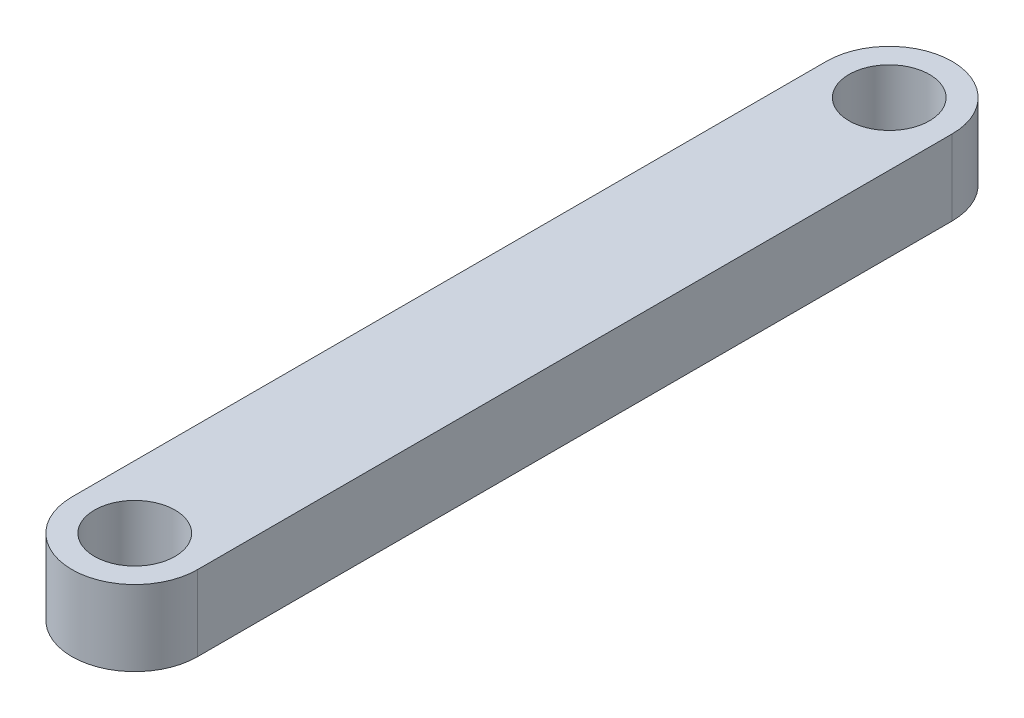
ISO-10303-21;
HEADER;
FILE_DESCRIPTION(('STEP AP214'),'2;1');
FILE_NAME('part.step','',(''),(''),'','','');
FILE_SCHEMA(('AUTOMOTIVE_DESIGN { 1 0 10303 214 1 1 1 1 }'));
ENDSEC;
DATA;
#1=APPLICATION_CONTEXT('core data for automotive mechanical design processes');
#2=APPLICATION_PROTOCOL_DEFINITION('international standard','automotive_design',2000,#1);
#3=PRODUCT_CONTEXT('',#1,'mechanical');
#4=PRODUCT('Part','Part','',(#3));
#5=PRODUCT_RELATED_PRODUCT_CATEGORY('part','',(#4));
#6=PRODUCT_DEFINITION_FORMATION('','',#4);
#7=PRODUCT_DEFINITION_CONTEXT('part definition',#1,'design');
#8=PRODUCT_DEFINITION('design','',#6,#7);
#9=PRODUCT_DEFINITION_SHAPE('','',#8);
#10=(LENGTH_UNIT() NAMED_UNIT(*) SI_UNIT(.MILLI.,.METRE.));
#11=(NAMED_UNIT(*) PLANE_ANGLE_UNIT() SI_UNIT($,.RADIAN.));
#12=(NAMED_UNIT(*) SI_UNIT($,.STERADIAN.) SOLID_ANGLE_UNIT());
#13=UNCERTAINTY_MEASURE_WITH_UNIT(LENGTH_MEASURE(1.E-05),#10,'distance_accuracy_value','');
#14=(GEOMETRIC_REPRESENTATION_CONTEXT(3) GLOBAL_UNCERTAINTY_ASSIGNED_CONTEXT((#13)) GLOBAL_UNIT_ASSIGNED_CONTEXT((#10,
#11,#12)) REPRESENTATION_CONTEXT('',''));
#15=CARTESIAN_POINT('',(0.,0.,0.));
#16=DIRECTION('',(0.,0.,1.));
#17=DIRECTION('',(1.,0.,0.));
#18=AXIS2_PLACEMENT_3D('',#15,#16,#17);
#19=CARTESIAN_POINT('',(0.,3.,0.));
#20=DIRECTION('',(0.,-1.,0.));
#21=DIRECTION('',(0.,0.,-1.));
#22=AXIS2_PLACEMENT_3D('',#19,#20,#21);
#23=CYLINDRICAL_SURFACE('',#22,2.5);
#24=CARTESIAN_POINT('',(0.,0.,0.));
#25=DIRECTION('',(0.,1.,0.));
#26=DIRECTION('',(0.,0.,1.));
#27=AXIS2_PLACEMENT_3D('',#24,#25,#26);
#28=CIRCLE('',#27,2.5);
#29=CARTESIAN_POINT('',(2.5,0.,0.));
#30=VERTEX_POINT('',#29);
#31=CARTESIAN_POINT('',(-2.5,0.,0.));
#32=VERTEX_POINT('',#31);
#33=EDGE_CURVE('E113',#30,#32,#28,.T.);
#34=ORIENTED_EDGE('',*,*,#33,.T.);
#35=DIRECTION('',(0.,-1.,0.));
#36=VECTOR('',#35,1.);
#37=CARTESIAN_POINT('',(-2.5,3.,0.));
#38=LINE('',#37,#36);
#39=CARTESIAN_POINT('',(-2.5,3.,0.));
#40=VERTEX_POINT('',#39);
#41=EDGE_CURVE('E11',#40,#32,#38,.T.);
#42=ORIENTED_EDGE('',*,*,#41,.F.);
#43=CARTESIAN_POINT('',(0.,3.,0.));
#44=DIRECTION('',(0.,1.,0.));
#45=DIRECTION('',(0.,0.,1.));
#46=AXIS2_PLACEMENT_3D('',#43,#44,#45);
#47=CIRCLE('',#46,2.5);
#48=CARTESIAN_POINT('',(2.5,3.,0.));
#49=VERTEX_POINT('',#48);
#50=EDGE_CURVE('E97',#49,#40,#47,.T.);
#51=ORIENTED_EDGE('',*,*,#50,.F.);
#52=DIRECTION('',(0.,-1.,0.));
#53=VECTOR('',#52,1.);
#54=CARTESIAN_POINT('',(2.5,3.,0.));
#55=LINE('',#54,#53);
#56=EDGE_CURVE('E109',#49,#30,#55,.T.);
#57=ORIENTED_EDGE('',*,*,#56,.T.);
#58=EDGE_LOOP('',(#34,#42,#51,#57));
#59=FACE_BOUND('',#58,.T.);
#60=ADVANCED_FACE('F45',(#59),#23,.T.);
#61=CARTESIAN_POINT('',(-2.5,3.,0.));
#62=DIRECTION('',(1.,0.,0.));
#63=DIRECTION('',(0.,0.,-1.));
#64=AXIS2_PLACEMENT_3D('',#61,#62,#63);
#65=PLANE('',#64);
#66=DIRECTION('',(0.,0.,1.));
#67=VECTOR('',#66,1.);
#68=CARTESIAN_POINT('',(-2.5,0.,0.));
#69=LINE('',#68,#67);
#70=CARTESIAN_POINT('',(-2.5,0.,30.));
#71=VERTEX_POINT('',#70);
#72=EDGE_CURVE('E102',#32,#71,#69,.T.);
#73=ORIENTED_EDGE('',*,*,#72,.T.);
#74=DIRECTION('',(0.,-1.,0.));
#75=VECTOR('',#74,1.);
#76=CARTESIAN_POINT('',(-2.5,3.,30.));
#77=LINE('',#76,#75);
#78=CARTESIAN_POINT('',(-2.5,3.,30.));
#79=VERTEX_POINT('',#78);
#80=EDGE_CURVE('E54',#79,#71,#77,.T.);
#81=ORIENTED_EDGE('',*,*,#80,.F.);
#82=DIRECTION('',(0.,0.,1.));
#83=VECTOR('',#82,1.);
#84=CARTESIAN_POINT('',(-2.5,3.,0.));
#85=LINE('',#84,#83);
#86=EDGE_CURVE('E92',#40,#79,#85,.T.);
#87=ORIENTED_EDGE('',*,*,#86,.F.);
#88=ORIENTED_EDGE('',*,*,#41,.T.);
#89=EDGE_LOOP('',(#73,#81,#87,#88));
#90=FACE_BOUND('',#89,.T.);
#91=ADVANCED_FACE('F101',(#90),#65,.F.);
#92=CARTESIAN_POINT('',(0.,3.,30.));
#93=DIRECTION('',(0.,-1.,0.));
#94=DIRECTION('',(0.,0.,-1.));
#95=AXIS2_PLACEMENT_3D('',#92,#93,#94);
#96=CYLINDRICAL_SURFACE('',#95,2.5);
#97=CARTESIAN_POINT('',(0.,0.,30.));
#98=DIRECTION('',(0.,1.,0.));
#99=DIRECTION('',(0.,0.,1.));
#100=AXIS2_PLACEMENT_3D('',#97,#98,#99);
#101=CIRCLE('',#100,2.5);
#102=CARTESIAN_POINT('',(2.5,0.,30.));
#103=VERTEX_POINT('',#102);
#104=EDGE_CURVE('E79',#71,#103,#101,.T.);
#105=ORIENTED_EDGE('',*,*,#104,.T.);
#106=DIRECTION('',(0.,-1.,0.));
#107=VECTOR('',#106,1.);
#108=CARTESIAN_POINT('',(2.5,3.,30.));
#109=LINE('',#108,#107);
#110=CARTESIAN_POINT('',(2.5,3.,30.));
#111=VERTEX_POINT('',#110);
#112=EDGE_CURVE('E104',#111,#103,#109,.T.);
#113=ORIENTED_EDGE('',*,*,#112,.F.);
#114=CARTESIAN_POINT('',(0.,3.,30.));
#115=DIRECTION('',(0.,1.,0.));
#116=DIRECTION('',(0.,0.,1.));
#117=AXIS2_PLACEMENT_3D('',#114,#115,#116);
#118=CIRCLE('',#117,2.5);
#119=EDGE_CURVE('E95',#79,#111,#118,.T.);
#120=ORIENTED_EDGE('',*,*,#119,.F.);
#121=ORIENTED_EDGE('',*,*,#80,.T.);
#122=EDGE_LOOP('',(#105,#113,#120,#121));
#123=FACE_BOUND('',#122,.T.);
#124=ADVANCED_FACE('F105',(#123),#96,.T.);
#125=CARTESIAN_POINT('',(2.5,3.,0.));
#126=DIRECTION('',(-1.,0.,0.));
#127=DIRECTION('',(0.,0.,1.));
#128=AXIS2_PLACEMENT_3D('',#125,#126,#127);
#129=PLANE('',#128);
#130=DIRECTION('',(0.,0.,-1.));
#131=VECTOR('',#130,1.);
#132=CARTESIAN_POINT('',(2.5,0.,0.));
#133=LINE('',#132,#131);
#134=EDGE_CURVE('E85',#103,#30,#133,.T.);
#135=ORIENTED_EDGE('',*,*,#134,.T.);
#136=ORIENTED_EDGE('',*,*,#56,.F.);
#137=DIRECTION('',(0.,0.,-1.));
#138=VECTOR('',#137,1.);
#139=CARTESIAN_POINT('',(2.5,3.,0.));
#140=LINE('',#139,#138);
#141=EDGE_CURVE('E62',#111,#49,#140,.T.);
#142=ORIENTED_EDGE('',*,*,#141,.F.);
#143=ORIENTED_EDGE('',*,*,#112,.T.);
#144=EDGE_LOOP('',(#135,#136,#142,#143));
#145=FACE_BOUND('',#144,.T.);
#146=ADVANCED_FACE('F127',(#145),#129,.F.);
#147=CARTESIAN_POINT('',(0.,3.,0.));
#148=DIRECTION('',(0.,1.,0.));
#149=DIRECTION('',(0.,0.,1.));
#150=AXIS2_PLACEMENT_3D('',#147,#148,#149);
#151=PLANE('',#150);
#152=CARTESIAN_POINT('',(0.,3.,0.));
#153=DIRECTION('',(0.,1.,0.));
#154=DIRECTION('',(0.,0.,1.));
#155=AXIS2_PLACEMENT_3D('',#152,#153,#154);
#156=CIRCLE('',#155,1.6);
#157=CARTESIAN_POINT('',(0.,3.,1.6));
#158=VERTEX_POINT('',#157);
#159=EDGE_CURVE('E142',#158,#158,#156,.T.);
#160=ORIENTED_EDGE('',*,*,#159,.F.);
#161=EDGE_LOOP('',(#160));
#162=FACE_BOUND('',#161,.T.);
#163=CARTESIAN_POINT('',(0.,3.,30.));
#164=DIRECTION('',(0.,1.,0.));
#165=DIRECTION('',(0.,0.,1.));
#166=AXIS2_PLACEMENT_3D('',#163,#164,#165);
#167=CIRCLE('',#166,1.6);
#168=CARTESIAN_POINT('',(0.,3.,31.6));
#169=VERTEX_POINT('',#168);
#170=EDGE_CURVE('E138',#169,#169,#167,.T.);
#171=ORIENTED_EDGE('',*,*,#170,.F.);
#172=EDGE_LOOP('',(#171));
#173=FACE_BOUND('',#172,.T.);
#174=ORIENTED_EDGE('',*,*,#50,.T.);
#175=ORIENTED_EDGE('',*,*,#86,.T.);
#176=ORIENTED_EDGE('',*,*,#119,.T.);
#177=ORIENTED_EDGE('',*,*,#141,.T.);
#178=EDGE_LOOP('',(#174,#175,#176,#177));
#179=FACE_BOUND('',#178,.T.);
#180=ADVANCED_FACE('F93',(#162,#173,#179),#151,.T.);
#181=CARTESIAN_POINT('',(0.,0.,0.));
#182=DIRECTION('',(0.,1.,0.));
#183=DIRECTION('',(0.,0.,1.));
#184=AXIS2_PLACEMENT_3D('',#181,#182,#183);
#185=PLANE('',#184);
#186=CARTESIAN_POINT('',(0.,0.,0.));
#187=DIRECTION('',(0.,1.,0.));
#188=DIRECTION('',(0.,0.,1.));
#189=AXIS2_PLACEMENT_3D('',#186,#187,#188);
#190=CIRCLE('',#189,1.6);
#191=CARTESIAN_POINT('',(0.,0.,1.6));
#192=VERTEX_POINT('',#191);
#193=EDGE_CURVE('E117',#192,#192,#190,.T.);
#194=ORIENTED_EDGE('',*,*,#193,.T.);
#195=EDGE_LOOP('',(#194));
#196=FACE_BOUND('',#195,.T.);
#197=CARTESIAN_POINT('',(0.,0.,30.));
#198=DIRECTION('',(0.,1.,0.));
#199=DIRECTION('',(0.,0.,1.));
#200=AXIS2_PLACEMENT_3D('',#197,#198,#199);
#201=CIRCLE('',#200,1.6);
#202=CARTESIAN_POINT('',(0.,0.,31.6));
#203=VERTEX_POINT('',#202);
#204=EDGE_CURVE('E134',#203,#203,#201,.T.);
#205=ORIENTED_EDGE('',*,*,#204,.T.);
#206=EDGE_LOOP('',(#205));
#207=FACE_BOUND('',#206,.T.);
#208=ORIENTED_EDGE('',*,*,#33,.F.);
#209=ORIENTED_EDGE('',*,*,#134,.F.);
#210=ORIENTED_EDGE('',*,*,#104,.F.);
#211=ORIENTED_EDGE('',*,*,#72,.F.);
#212=EDGE_LOOP('',(#208,#209,#210,#211));
#213=FACE_BOUND('',#212,.T.);
#214=ADVANCED_FACE('F130',(#196,#207,#213),#185,.F.);
#215=CARTESIAN_POINT('',(0.,0.,30.));
#216=DIRECTION('',(0.,1.,0.));
#217=DIRECTION('',(0.,0.,1.));
#218=AXIS2_PLACEMENT_3D('',#215,#216,#217);
#219=CYLINDRICAL_SURFACE('',#218,1.6);
#220=ORIENTED_EDGE('',*,*,#204,.F.);
#221=EDGE_LOOP('',(#220));
#222=FACE_BOUND('',#221,.T.);
#223=ORIENTED_EDGE('',*,*,#170,.T.);
#224=EDGE_LOOP('',(#223));
#225=FACE_BOUND('',#224,.T.);
#226=ADVANCED_FACE('F155',(#222,#225),#219,.F.);
#227=CARTESIAN_POINT('',(0.,0.,0.));
#228=DIRECTION('',(0.,1.,0.));
#229=DIRECTION('',(0.,0.,1.));
#230=AXIS2_PLACEMENT_3D('',#227,#228,#229);
#231=CYLINDRICAL_SURFACE('',#230,1.6);
#232=ORIENTED_EDGE('',*,*,#193,.F.);
#233=EDGE_LOOP('',(#232));
#234=FACE_BOUND('',#233,.T.);
#235=ORIENTED_EDGE('',*,*,#159,.T.);
#236=EDGE_LOOP('',(#235));
#237=FACE_BOUND('',#236,.T.);
#238=ADVANCED_FACE('F152',(#234,#237),#231,.F.);
#239=CLOSED_SHELL('',(#60,#91,#124,#146,#180,#214,#226,#238));
#240=MANIFOLD_SOLID_BREP('B2',#239);
#241=ADVANCED_BREP_SHAPE_REPRESENTATION('',(#18,#240),#14);
#242=SHAPE_DEFINITION_REPRESENTATION(#9,#241);
ENDSEC;
END-ISO-10303-21;
